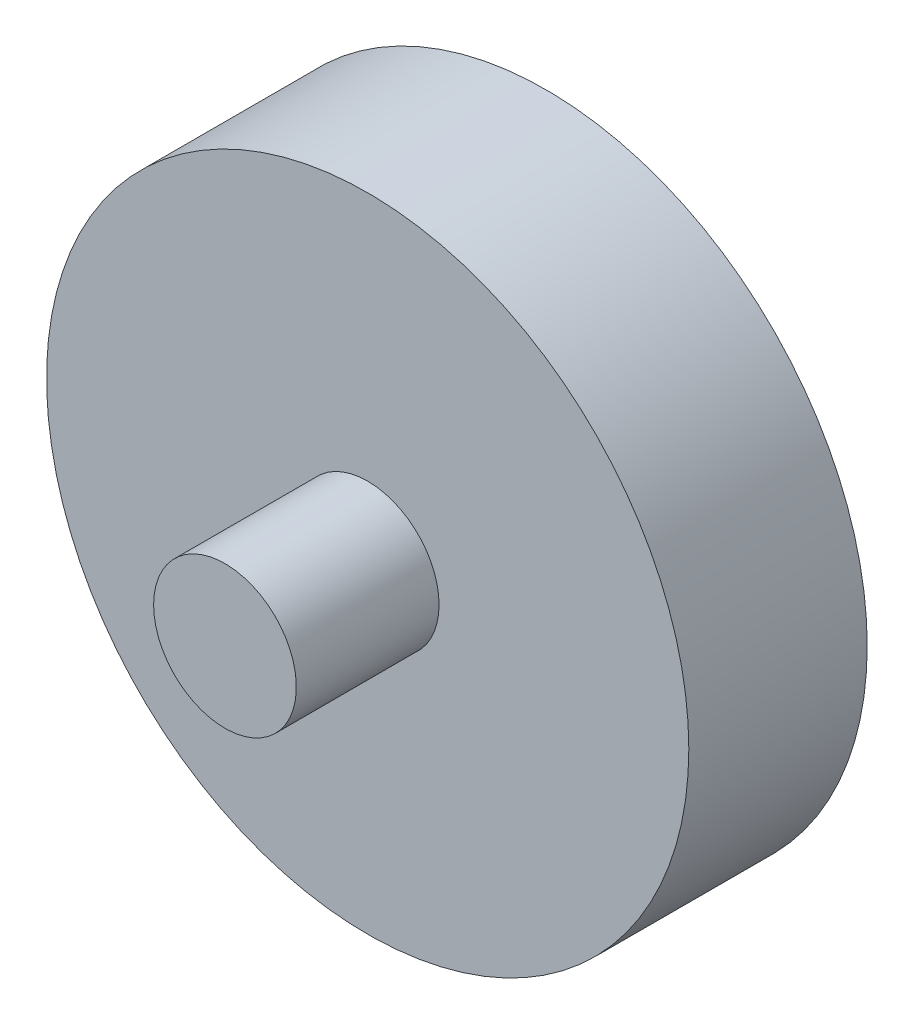
ISO-10303-21;
HEADER;
FILE_DESCRIPTION(('STEP AP214'),'2;1');
FILE_NAME('part.step','',(''),(''),'','','');
FILE_SCHEMA(('AUTOMOTIVE_DESIGN { 1 0 10303 214 1 1 1 1 }'));
ENDSEC;
DATA;
#1=APPLICATION_CONTEXT('core data for automotive mechanical design processes');
#2=APPLICATION_PROTOCOL_DEFINITION('international standard','automotive_design',2000,#1);
#3=PRODUCT_CONTEXT('',#1,'mechanical');
#4=PRODUCT('Part','Part','',(#3));
#5=PRODUCT_RELATED_PRODUCT_CATEGORY('part','',(#4));
#6=PRODUCT_DEFINITION_FORMATION('','',#4);
#7=PRODUCT_DEFINITION_CONTEXT('part definition',#1,'design');
#8=PRODUCT_DEFINITION('design','',#6,#7);
#9=PRODUCT_DEFINITION_SHAPE('','',#8);
#10=(LENGTH_UNIT() NAMED_UNIT(*) SI_UNIT(.MILLI.,.METRE.));
#11=(NAMED_UNIT(*) PLANE_ANGLE_UNIT() SI_UNIT($,.RADIAN.));
#12=(NAMED_UNIT(*) SI_UNIT($,.STERADIAN.) SOLID_ANGLE_UNIT());
#13=UNCERTAINTY_MEASURE_WITH_UNIT(LENGTH_MEASURE(1.E-05),#10,'distance_accuracy_value','');
#14=(GEOMETRIC_REPRESENTATION_CONTEXT(3) GLOBAL_UNCERTAINTY_ASSIGNED_CONTEXT((#13)) GLOBAL_UNIT_ASSIGNED_CONTEXT((#10,
#11,#12)) REPRESENTATION_CONTEXT('',''));
#15=CARTESIAN_POINT('',(0.,0.,0.));
#16=DIRECTION('',(0.,0.,1.));
#17=DIRECTION('',(1.,0.,0.));
#18=AXIS2_PLACEMENT_3D('',#15,#16,#17);
#19=CARTESIAN_POINT('',(0.,0.,6.35));
#20=DIRECTION('',(0.,0.,-1.));
#21=DIRECTION('',(-1.,0.,0.));
#22=AXIS2_PLACEMENT_3D('',#19,#20,#21);
#23=CYLINDRICAL_SURFACE('',#22,11.43);
#24=CARTESIAN_POINT('',(0.,0.,6.35));
#25=DIRECTION('',(0.,0.,1.));
#26=DIRECTION('',(1.,0.,0.));
#27=AXIS2_PLACEMENT_3D('',#24,#25,#26);
#28=CIRCLE('',#27,11.43);
#29=CARTESIAN_POINT('',(11.43,0.,6.35));
#30=VERTEX_POINT('',#29);
#31=EDGE_CURVE('E37',#30,#30,#28,.T.);
#32=ORIENTED_EDGE('',*,*,#31,.F.);
#33=EDGE_LOOP('',(#32));
#34=FACE_BOUND('',#33,.T.);
#35=CARTESIAN_POINT('',(0.,0.,0.));
#36=DIRECTION('',(0.,0.,1.));
#37=DIRECTION('',(1.,0.,0.));
#38=AXIS2_PLACEMENT_3D('',#35,#36,#37);
#39=CIRCLE('',#38,11.43);
#40=CARTESIAN_POINT('',(11.43,0.,0.));
#41=VERTEX_POINT('',#40);
#42=EDGE_CURVE('E42',#41,#41,#39,.T.);
#43=ORIENTED_EDGE('',*,*,#42,.T.);
#44=EDGE_LOOP('',(#43));
#45=FACE_BOUND('',#44,.T.);
#46=ADVANCED_FACE('F30',(#34,#45),#23,.T.);
#47=CARTESIAN_POINT('',(0.,0.,6.35));
#48=DIRECTION('',(0.,0.,1.));
#49=DIRECTION('',(1.,0.,0.));
#50=AXIS2_PLACEMENT_3D('',#47,#48,#49);
#51=PLANE('',#50);
#52=CARTESIAN_POINT('',(0.,0.,6.35));
#53=DIRECTION('',(0.,0.,1.));
#54=DIRECTION('',(1.,0.,0.));
#55=AXIS2_PLACEMENT_3D('',#52,#53,#54);
#56=CIRCLE('',#55,2.54);
#57=CARTESIAN_POINT('',(2.54,0.,6.35));
#58=VERTEX_POINT('',#57);
#59=EDGE_CURVE('E10',#58,#58,#56,.T.);
#60=ORIENTED_EDGE('',*,*,#59,.F.);
#61=EDGE_LOOP('',(#60));
#62=FACE_BOUND('',#61,.T.);
#63=ORIENTED_EDGE('',*,*,#31,.T.);
#64=EDGE_LOOP('',(#63));
#65=FACE_BOUND('',#64,.T.);
#66=ADVANCED_FACE('F77',(#62,#65),#51,.T.);
#67=CARTESIAN_POINT('',(0.,0.,0.));
#68=DIRECTION('',(0.,0.,1.));
#69=DIRECTION('',(1.,0.,0.));
#70=AXIS2_PLACEMENT_3D('',#67,#68,#69);
#71=PLANE('',#70);
#72=CARTESIAN_POINT('',(0.,0.,0.));
#73=DIRECTION('',(0.,0.,1.));
#74=DIRECTION('',(1.,0.,0.));
#75=AXIS2_PLACEMENT_3D('',#72,#73,#74);
#76=CIRCLE('',#75,2.54);
#77=CARTESIAN_POINT('',(2.54,0.,0.));
#78=VERTEX_POINT('',#77);
#79=EDGE_CURVE('E33',#78,#78,#76,.T.);
#80=ORIENTED_EDGE('',*,*,#79,.T.);
#81=EDGE_LOOP('',(#80));
#82=FACE_BOUND('',#81,.T.);
#83=ORIENTED_EDGE('',*,*,#42,.F.);
#84=EDGE_LOOP('',(#83));
#85=FACE_BOUND('',#84,.T.);
#86=ADVANCED_FACE('F72',(#82,#85),#71,.F.);
#87=CARTESIAN_POINT('',(0.,0.,-5.08));
#88=DIRECTION('',(0.,0.,-1.));
#89=DIRECTION('',(-1.,0.,0.));
#90=AXIS2_PLACEMENT_3D('',#87,#88,#89);
#91=PLANE('',#90);
#92=CARTESIAN_POINT('',(0.,0.,-5.08));
#93=DIRECTION('',(0.,0.,-1.));
#94=DIRECTION('',(-1.,0.,0.));
#95=AXIS2_PLACEMENT_3D('',#92,#93,#94);
#96=CIRCLE('',#95,2.54);
#97=CARTESIAN_POINT('',(-2.54,0.,-5.08));
#98=VERTEX_POINT('',#97);
#99=EDGE_CURVE('E54',#98,#98,#96,.T.);
#100=ORIENTED_EDGE('',*,*,#99,.T.);
#101=EDGE_LOOP('',(#100));
#102=FACE_BOUND('',#101,.T.);
#103=ADVANCED_FACE('F60',(#102),#91,.T.);
#104=CARTESIAN_POINT('',(0.,0.,11.43));
#105=DIRECTION('',(0.,0.,-1.));
#106=DIRECTION('',(-1.,0.,0.));
#107=AXIS2_PLACEMENT_3D('',#104,#105,#106);
#108=CYLINDRICAL_SURFACE('',#107,2.54);
#109=ORIENTED_EDGE('',*,*,#99,.F.);
#110=EDGE_LOOP('',(#109));
#111=FACE_BOUND('',#110,.T.);
#112=ORIENTED_EDGE('',*,*,#79,.F.);
#113=EDGE_LOOP('',(#112));
#114=FACE_BOUND('',#113,.T.);
#115=ADVANCED_FACE('F62',(#111,#114),#108,.T.);
#116=ORIENTED_EDGE('',*,*,#59,.T.);
#117=EDGE_LOOP('',(#116));
#118=FACE_BOUND('',#117,.T.);
#119=CARTESIAN_POINT('',(0.,0.,11.43));
#120=DIRECTION('',(0.,0.,-1.));
#121=DIRECTION('',(-1.,0.,0.));
#122=AXIS2_PLACEMENT_3D('',#119,#120,#121);
#123=CIRCLE('',#122,2.54);
#124=CARTESIAN_POINT('',(-2.54,0.,11.43));
#125=VERTEX_POINT('',#124);
#126=EDGE_CURVE('E45',#125,#125,#123,.T.);
#127=ORIENTED_EDGE('',*,*,#126,.T.);
#128=EDGE_LOOP('',(#127));
#129=FACE_BOUND('',#128,.T.);
#130=ADVANCED_FACE('F65',(#118,#129),#108,.T.);
#131=CARTESIAN_POINT('',(0.,0.,11.43));
#132=DIRECTION('',(0.,0.,-1.));
#133=DIRECTION('',(-1.,0.,0.));
#134=AXIS2_PLACEMENT_3D('',#131,#132,#133);
#135=PLANE('',#134);
#136=ORIENTED_EDGE('',*,*,#126,.F.);
#137=EDGE_LOOP('',(#136));
#138=FACE_BOUND('',#137,.T.);
#139=ADVANCED_FACE('F71',(#138),#135,.F.);
#140=CLOSED_SHELL('',(#46,#66,#86,#103,#115,#130,#139));
#141=MANIFOLD_SOLID_BREP('B2',#140);
#142=ADVANCED_BREP_SHAPE_REPRESENTATION('',(#18,#141),#14);
#143=SHAPE_DEFINITION_REPRESENTATION(#9,#142);
ENDSEC;
END-ISO-10303-21;
